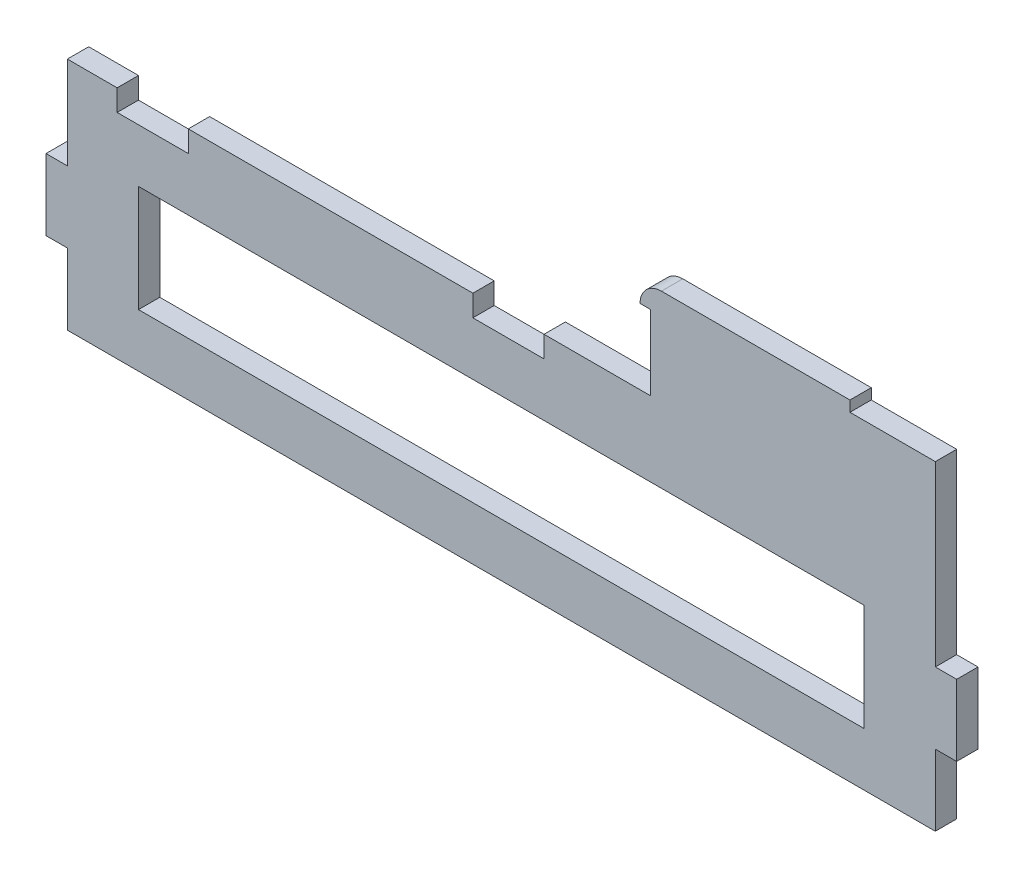
ISO-10303-21;
HEADER;
FILE_DESCRIPTION(('STEP AP214'),'2;1');
FILE_NAME('part.step','',(''),(''),'','','');
FILE_SCHEMA(('AUTOMOTIVE_DESIGN { 1 0 10303 214 1 1 1 1 }'));
ENDSEC;
DATA;
#1=APPLICATION_CONTEXT('core data for automotive mechanical design processes');
#2=APPLICATION_PROTOCOL_DEFINITION('international standard','automotive_design',2000,#1);
#3=PRODUCT_CONTEXT('',#1,'mechanical');
#4=PRODUCT('Part','Part','',(#3));
#5=PRODUCT_RELATED_PRODUCT_CATEGORY('part','',(#4));
#6=PRODUCT_DEFINITION_FORMATION('','',#4);
#7=PRODUCT_DEFINITION_CONTEXT('part definition',#1,'design');
#8=PRODUCT_DEFINITION('design','',#6,#7);
#9=PRODUCT_DEFINITION_SHAPE('','',#8);
#10=(LENGTH_UNIT() NAMED_UNIT(*) SI_UNIT(.MILLI.,.METRE.));
#11=(NAMED_UNIT(*) PLANE_ANGLE_UNIT() SI_UNIT($,.RADIAN.));
#12=(NAMED_UNIT(*) SI_UNIT($,.STERADIAN.) SOLID_ANGLE_UNIT());
#13=UNCERTAINTY_MEASURE_WITH_UNIT(LENGTH_MEASURE(1.E-05),#10,'distance_accuracy_value','');
#14=(GEOMETRIC_REPRESENTATION_CONTEXT(3) GLOBAL_UNCERTAINTY_ASSIGNED_CONTEXT((#13)) GLOBAL_UNIT_ASSIGNED_CONTEXT((#10,
#11,#12)) REPRESENTATION_CONTEXT('',''));
#15=CARTESIAN_POINT('',(0.,0.,0.));
#16=DIRECTION('',(0.,0.,1.));
#17=DIRECTION('',(1.,0.,0.));
#18=AXIS2_PLACEMENT_3D('',#15,#16,#17);
#19=CARTESIAN_POINT('',(167.,87.,6.));
#20=DIRECTION('',(0.,0.,-1.));
#21=DIRECTION('',(-1.,0.,0.));
#22=AXIS2_PLACEMENT_3D('',#19,#20,#21);
#23=CYLINDRICAL_SURFACE('',#22,6.);
#24=DIRECTION('',(0.,0.,-1.));
#25=VECTOR('',#24,1.);
#26=CARTESIAN_POINT('',(161.,87.,6.));
#27=LINE('',#26,#25);
#28=CARTESIAN_POINT('',(161.,87.,6.));
#29=VERTEX_POINT('',#28);
#30=CARTESIAN_POINT('',(161.,87.,0.));
#31=VERTEX_POINT('',#30);
#32=EDGE_CURVE('E506',#29,#31,#27,.T.);
#33=ORIENTED_EDGE('',*,*,#32,.F.);
#34=CARTESIAN_POINT('',(167.,87.,6.));
#35=DIRECTION('',(0.,0.,1.));
#36=DIRECTION('',(1.,0.,0.));
#37=AXIS2_PLACEMENT_3D('',#34,#35,#36);
#38=CIRCLE('',#37,6.);
#39=CARTESIAN_POINT('',(167.,93.,6.));
#40=VERTEX_POINT('',#39);
#41=EDGE_CURVE('E47',#40,#29,#38,.T.);
#42=ORIENTED_EDGE('',*,*,#41,.F.);
#43=DIRECTION('',(0.,0.,-1.));
#44=VECTOR('',#43,1.);
#45=CARTESIAN_POINT('',(167.,93.,6.));
#46=LINE('',#45,#44);
#47=CARTESIAN_POINT('',(167.,93.,0.));
#48=VERTEX_POINT('',#47);
#49=EDGE_CURVE('E542',#48,#40,#46,.F.);
#50=ORIENTED_EDGE('',*,*,#49,.F.);
#51=CARTESIAN_POINT('',(167.,87.,0.));
#52=DIRECTION('',(0.,0.,1.));
#53=DIRECTION('',(1.,0.,0.));
#54=AXIS2_PLACEMENT_3D('',#51,#52,#53);
#55=CIRCLE('',#54,6.);
#56=EDGE_CURVE('E11',#31,#48,#55,.F.);
#57=ORIENTED_EDGE('',*,*,#56,.F.);
#58=EDGE_LOOP('',(#33,#42,#50,#57));
#59=FACE_BOUND('',#58,.T.);
#60=ADVANCED_FACE('F39',(#59),#23,.T.);
#61=CARTESIAN_POINT('',(0.,0.,6.));
#62=DIRECTION('',(0.,0.,1.));
#63=DIRECTION('',(1.,0.,0.));
#64=AXIS2_PLACEMENT_3D('',#61,#62,#63);
#65=PLANE('',#64);
#66=DIRECTION('',(-1.,0.,0.));
#67=VECTOR('',#66,1.);
#68=CARTESIAN_POINT('',(161.,93.,6.));
#69=LINE('',#68,#67);
#70=CARTESIAN_POINT('',(220.,93.,6.));
#71=VERTEX_POINT('',#70);
#72=EDGE_CURVE('E315',#71,#40,#69,.T.);
#73=ORIENTED_EDGE('',*,*,#72,.T.);
#74=ORIENTED_EDGE('',*,*,#41,.T.);
#75=DIRECTION('',(1.,0.,0.));
#76=VECTOR('',#75,1.);
#77=CARTESIAN_POINT('',(164.,87.,6.));
#78=LINE('',#77,#76);
#79=CARTESIAN_POINT('',(164.,87.,6.));
#80=VERTEX_POINT('',#79);
#81=EDGE_CURVE('E319',#29,#80,#78,.T.);
#82=ORIENTED_EDGE('',*,*,#81,.T.);
#83=DIRECTION('',(0.,-1.,0.));
#84=VECTOR('',#83,1.);
#85=CARTESIAN_POINT('',(164.,87.,6.));
#86=LINE('',#85,#84);
#87=CARTESIAN_POINT('',(164.,66.,6.));
#88=VERTEX_POINT('',#87);
#89=EDGE_CURVE('E322',#80,#88,#86,.T.);
#90=ORIENTED_EDGE('',*,*,#89,.T.);
#91=DIRECTION('',(-1.,0.,0.));
#92=VECTOR('',#91,1.);
#93=CARTESIAN_POINT('',(164.,66.,6.));
#94=LINE('',#93,#92);
#95=CARTESIAN_POINT('',(134.,66.,6.));
#96=VERTEX_POINT('',#95);
#97=EDGE_CURVE('E325',#88,#96,#94,.T.);
#98=ORIENTED_EDGE('',*,*,#97,.T.);
#99=DIRECTION('',(0.,-1.,0.));
#100=VECTOR('',#99,1.);
#101=CARTESIAN_POINT('',(134.,66.,6.));
#102=LINE('',#101,#100);
#103=CARTESIAN_POINT('',(134.,60.,6.));
#104=VERTEX_POINT('',#103);
#105=EDGE_CURVE('E328',#96,#104,#102,.T.);
#106=ORIENTED_EDGE('',*,*,#105,.T.);
#107=DIRECTION('',(-1.,0.,0.));
#108=VECTOR('',#107,1.);
#109=CARTESIAN_POINT('',(134.,60.,6.));
#110=LINE('',#109,#108);
#111=CARTESIAN_POINT('',(114.,60.,6.));
#112=VERTEX_POINT('',#111);
#113=EDGE_CURVE('E331',#104,#112,#110,.T.);
#114=ORIENTED_EDGE('',*,*,#113,.T.);
#115=DIRECTION('',(0.,1.,0.));
#116=VECTOR('',#115,1.);
#117=CARTESIAN_POINT('',(114.,60.,6.));
#118=LINE('',#117,#116);
#119=CARTESIAN_POINT('',(114.,66.,6.));
#120=VERTEX_POINT('',#119);
#121=EDGE_CURVE('E334',#112,#120,#118,.T.);
#122=ORIENTED_EDGE('',*,*,#121,.T.);
#123=DIRECTION('',(-1.,0.,0.));
#124=VECTOR('',#123,1.);
#125=CARTESIAN_POINT('',(114.,66.,6.));
#126=LINE('',#125,#124);
#127=CARTESIAN_POINT('',(34.,66.,6.));
#128=VERTEX_POINT('',#127);
#129=EDGE_CURVE('E337',#120,#128,#126,.T.);
#130=ORIENTED_EDGE('',*,*,#129,.T.);
#131=DIRECTION('',(0.,-1.,0.));
#132=VECTOR('',#131,1.);
#133=CARTESIAN_POINT('',(34.,66.,6.));
#134=LINE('',#133,#132);
#135=CARTESIAN_POINT('',(34.,60.,6.));
#136=VERTEX_POINT('',#135);
#137=EDGE_CURVE('E340',#128,#136,#134,.T.);
#138=ORIENTED_EDGE('',*,*,#137,.T.);
#139=DIRECTION('',(-1.,0.,0.));
#140=VECTOR('',#139,1.);
#141=CARTESIAN_POINT('',(34.,60.,6.));
#142=LINE('',#141,#140);
#143=CARTESIAN_POINT('',(14.,60.,6.));
#144=VERTEX_POINT('',#143);
#145=EDGE_CURVE('E343',#136,#144,#142,.T.);
#146=ORIENTED_EDGE('',*,*,#145,.T.);
#147=DIRECTION('',(0.,1.,0.));
#148=VECTOR('',#147,1.);
#149=CARTESIAN_POINT('',(14.,60.,6.));
#150=LINE('',#149,#148);
#151=CARTESIAN_POINT('',(14.,66.,6.));
#152=VERTEX_POINT('',#151);
#153=EDGE_CURVE('E346',#144,#152,#150,.T.);
#154=ORIENTED_EDGE('',*,*,#153,.T.);
#155=DIRECTION('',(-1.,0.,0.));
#156=VECTOR('',#155,1.);
#157=CARTESIAN_POINT('',(14.,66.,6.));
#158=LINE('',#157,#156);
#159=CARTESIAN_POINT('',(0.,66.,6.));
#160=VERTEX_POINT('',#159);
#161=EDGE_CURVE('E349',#152,#160,#158,.T.);
#162=ORIENTED_EDGE('',*,*,#161,.T.);
#163=DIRECTION('',(0.,-1.,0.));
#164=VECTOR('',#163,1.);
#165=CARTESIAN_POINT('',(0.,66.,6.));
#166=LINE('',#165,#164);
#167=CARTESIAN_POINT('',(0.,40.,6.));
#168=VERTEX_POINT('',#167);
#169=EDGE_CURVE('E352',#160,#168,#166,.T.);
#170=ORIENTED_EDGE('',*,*,#169,.T.);
#171=DIRECTION('',(-1.,0.,0.));
#172=VECTOR('',#171,1.);
#173=CARTESIAN_POINT('',(0.,40.,6.));
#174=LINE('',#173,#172);
#175=CARTESIAN_POINT('',(-6.,40.,6.));
#176=VERTEX_POINT('',#175);
#177=EDGE_CURVE('E355',#168,#176,#174,.T.);
#178=ORIENTED_EDGE('',*,*,#177,.T.);
#179=DIRECTION('',(0.,-1.,0.));
#180=VECTOR('',#179,1.);
#181=CARTESIAN_POINT('',(-6.,40.,6.));
#182=LINE('',#181,#180);
#183=CARTESIAN_POINT('',(-6.,20.,6.));
#184=VERTEX_POINT('',#183);
#185=EDGE_CURVE('E358',#176,#184,#182,.T.);
#186=ORIENTED_EDGE('',*,*,#185,.T.);
#187=DIRECTION('',(1.,0.,0.));
#188=VECTOR('',#187,1.);
#189=CARTESIAN_POINT('',(0.,20.,6.));
#190=LINE('',#189,#188);
#191=CARTESIAN_POINT('',(0.,20.,6.));
#192=VERTEX_POINT('',#191);
#193=EDGE_CURVE('E361',#184,#192,#190,.T.);
#194=ORIENTED_EDGE('',*,*,#193,.T.);
#195=DIRECTION('',(0.,-1.,0.));
#196=VECTOR('',#195,1.);
#197=CARTESIAN_POINT('',(0.,20.,6.));
#198=LINE('',#197,#196);
#199=CARTESIAN_POINT('',(0.,0.,6.));
#200=VERTEX_POINT('',#199);
#201=EDGE_CURVE('E364',#192,#200,#198,.T.);
#202=ORIENTED_EDGE('',*,*,#201,.T.);
#203=DIRECTION('',(1.,0.,0.));
#204=VECTOR('',#203,1.);
#205=CARTESIAN_POINT('',(0.,0.,6.));
#206=LINE('',#205,#204);
#207=CARTESIAN_POINT('',(244.,0.,6.));
#208=VERTEX_POINT('',#207);
#209=EDGE_CURVE('E289',#200,#208,#206,.T.);
#210=ORIENTED_EDGE('',*,*,#209,.T.);
#211=DIRECTION('',(0.,1.,0.));
#212=VECTOR('',#211,1.);
#213=CARTESIAN_POINT('',(244.,0.,6.));
#214=LINE('',#213,#212);
#215=CARTESIAN_POINT('',(244.,20.,6.));
#216=VERTEX_POINT('',#215);
#217=EDGE_CURVE('E293',#208,#216,#214,.T.);
#218=ORIENTED_EDGE('',*,*,#217,.T.);
#219=DIRECTION('',(1.,0.,0.));
#220=VECTOR('',#219,1.);
#221=CARTESIAN_POINT('',(244.,20.,6.));
#222=LINE('',#221,#220);
#223=CARTESIAN_POINT('',(250.,20.,6.));
#224=VERTEX_POINT('',#223);
#225=EDGE_CURVE('E297',#216,#224,#222,.T.);
#226=ORIENTED_EDGE('',*,*,#225,.T.);
#227=DIRECTION('',(0.,1.,0.));
#228=VECTOR('',#227,1.);
#229=CARTESIAN_POINT('',(250.,40.,6.));
#230=LINE('',#229,#228);
#231=CARTESIAN_POINT('',(250.,40.,6.));
#232=VERTEX_POINT('',#231);
#233=EDGE_CURVE('E300',#224,#232,#230,.T.);
#234=ORIENTED_EDGE('',*,*,#233,.T.);
#235=DIRECTION('',(-1.,0.,0.));
#236=VECTOR('',#235,1.);
#237=CARTESIAN_POINT('',(244.,40.,6.));
#238=LINE('',#237,#236);
#239=CARTESIAN_POINT('',(244.,40.,6.));
#240=VERTEX_POINT('',#239);
#241=EDGE_CURVE('E303',#232,#240,#238,.T.);
#242=ORIENTED_EDGE('',*,*,#241,.T.);
#243=DIRECTION('',(0.,1.,0.));
#244=VECTOR('',#243,1.);
#245=CARTESIAN_POINT('',(244.,90.,6.));
#246=LINE('',#245,#244);
#247=CARTESIAN_POINT('',(244.,90.,6.));
#248=VERTEX_POINT('',#247);
#249=EDGE_CURVE('E306',#240,#248,#246,.T.);
#250=ORIENTED_EDGE('',*,*,#249,.T.);
#251=DIRECTION('',(-1.,0.,0.));
#252=VECTOR('',#251,1.);
#253=CARTESIAN_POINT('',(220.,90.,6.));
#254=LINE('',#253,#252);
#255=CARTESIAN_POINT('',(220.,90.,6.));
#256=VERTEX_POINT('',#255);
#257=EDGE_CURVE('E309',#248,#256,#254,.T.);
#258=ORIENTED_EDGE('',*,*,#257,.T.);
#259=DIRECTION('',(0.,1.,0.));
#260=VECTOR('',#259,1.);
#261=CARTESIAN_POINT('',(220.,93.,6.));
#262=LINE('',#261,#260);
#263=EDGE_CURVE('E312',#256,#71,#262,.T.);
#264=ORIENTED_EDGE('',*,*,#263,.T.);
#265=EDGE_LOOP('',(#73,#74,#82,#90,#98,#106,#114,#122,#130,#138,#146,#154,#162,#170,#178,#186,
#194,#202,#210,#218,#226,#234,#242,#250,#258,#264));
#266=FACE_BOUND('',#265,.T.);
#267=DIRECTION('',(1.,0.,0.));
#268=VECTOR('',#267,1.);
#269=CARTESIAN_POINT('',(20.,15.,6.));
#270=LINE('',#269,#268);
#271=CARTESIAN_POINT('',(20.,15.,6.));
#272=VERTEX_POINT('',#271);
#273=CARTESIAN_POINT('',(224.,15.,6.));
#274=VERTEX_POINT('',#273);
#275=EDGE_CURVE('E246',#272,#274,#270,.T.);
#276=ORIENTED_EDGE('',*,*,#275,.F.);
#277=DIRECTION('',(0.,-1.,0.));
#278=VECTOR('',#277,1.);
#279=CARTESIAN_POINT('',(20.,15.,6.));
#280=LINE('',#279,#278);
#281=CARTESIAN_POINT('',(20.,45.,6.));
#282=VERTEX_POINT('',#281);
#283=EDGE_CURVE('E235',#282,#272,#280,.T.);
#284=ORIENTED_EDGE('',*,*,#283,.F.);
#285=DIRECTION('',(-1.,0.,0.));
#286=VECTOR('',#285,1.);
#287=CARTESIAN_POINT('',(20.,45.,6.));
#288=LINE('',#287,#286);
#289=CARTESIAN_POINT('',(224.,45.,6.));
#290=VERTEX_POINT('',#289);
#291=EDGE_CURVE('E265',#290,#282,#288,.T.);
#292=ORIENTED_EDGE('',*,*,#291,.F.);
#293=DIRECTION('',(0.,1.,0.));
#294=VECTOR('',#293,1.);
#295=CARTESIAN_POINT('',(224.,15.,6.));
#296=LINE('',#295,#294);
#297=EDGE_CURVE('E261',#274,#290,#296,.T.);
#298=ORIENTED_EDGE('',*,*,#297,.F.);
#299=EDGE_LOOP('',(#276,#284,#292,#298));
#300=FACE_BOUND('',#299,.T.);
#301=ADVANCED_FACE('F259',(#266,#300),#65,.T.);
#302=CARTESIAN_POINT('',(0.,0.,0.));
#303=DIRECTION('',(0.,0.,1.));
#304=DIRECTION('',(1.,0.,0.));
#305=AXIS2_PLACEMENT_3D('',#302,#303,#304);
#306=PLANE('',#305);
#307=DIRECTION('',(1.,0.,0.));
#308=VECTOR('',#307,1.);
#309=CARTESIAN_POINT('',(164.,87.,0.));
#310=LINE('',#309,#308);
#311=CARTESIAN_POINT('',(164.,87.,0.));
#312=VERTEX_POINT('',#311);
#313=EDGE_CURVE('E396',#31,#312,#310,.T.);
#314=ORIENTED_EDGE('',*,*,#313,.F.);
#315=ORIENTED_EDGE('',*,*,#56,.T.);
#316=DIRECTION('',(-1.,0.,0.));
#317=VECTOR('',#316,1.);
#318=CARTESIAN_POINT('',(161.,93.,0.));
#319=LINE('',#318,#317);
#320=CARTESIAN_POINT('',(220.,93.,0.));
#321=VERTEX_POINT('',#320);
#322=EDGE_CURVE('E392',#321,#48,#319,.T.);
#323=ORIENTED_EDGE('',*,*,#322,.F.);
#324=DIRECTION('',(0.,1.,0.));
#325=VECTOR('',#324,1.);
#326=CARTESIAN_POINT('',(220.,93.,0.));
#327=LINE('',#326,#325);
#328=CARTESIAN_POINT('',(220.,90.,0.));
#329=VERTEX_POINT('',#328);
#330=EDGE_CURVE('E389',#329,#321,#327,.T.);
#331=ORIENTED_EDGE('',*,*,#330,.F.);
#332=DIRECTION('',(-1.,0.,0.));
#333=VECTOR('',#332,1.);
#334=CARTESIAN_POINT('',(220.,90.,0.));
#335=LINE('',#334,#333);
#336=CARTESIAN_POINT('',(244.,90.,0.));
#337=VERTEX_POINT('',#336);
#338=EDGE_CURVE('E386',#337,#329,#335,.T.);
#339=ORIENTED_EDGE('',*,*,#338,.F.);
#340=DIRECTION('',(0.,1.,0.));
#341=VECTOR('',#340,1.);
#342=CARTESIAN_POINT('',(244.,90.,0.));
#343=LINE('',#342,#341);
#344=CARTESIAN_POINT('',(244.,40.,0.));
#345=VERTEX_POINT('',#344);
#346=EDGE_CURVE('E383',#345,#337,#343,.T.);
#347=ORIENTED_EDGE('',*,*,#346,.F.);
#348=DIRECTION('',(-1.,0.,0.));
#349=VECTOR('',#348,1.);
#350=CARTESIAN_POINT('',(244.,40.,0.));
#351=LINE('',#350,#349);
#352=CARTESIAN_POINT('',(250.,40.,0.));
#353=VERTEX_POINT('',#352);
#354=EDGE_CURVE('E380',#353,#345,#351,.T.);
#355=ORIENTED_EDGE('',*,*,#354,.F.);
#356=DIRECTION('',(0.,1.,0.));
#357=VECTOR('',#356,1.);
#358=CARTESIAN_POINT('',(250.,40.,0.));
#359=LINE('',#358,#357);
#360=CARTESIAN_POINT('',(250.,20.,0.));
#361=VERTEX_POINT('',#360);
#362=EDGE_CURVE('E377',#361,#353,#359,.T.);
#363=ORIENTED_EDGE('',*,*,#362,.F.);
#364=DIRECTION('',(1.,0.,0.));
#365=VECTOR('',#364,1.);
#366=CARTESIAN_POINT('',(244.,20.,0.));
#367=LINE('',#366,#365);
#368=CARTESIAN_POINT('',(244.,20.,0.));
#369=VERTEX_POINT('',#368);
#370=EDGE_CURVE('E374',#369,#361,#367,.T.);
#371=ORIENTED_EDGE('',*,*,#370,.F.);
#372=DIRECTION('',(0.,1.,0.));
#373=VECTOR('',#372,1.);
#374=CARTESIAN_POINT('',(244.,0.,0.));
#375=LINE('',#374,#373);
#376=CARTESIAN_POINT('',(244.,0.,0.));
#377=VERTEX_POINT('',#376);
#378=EDGE_CURVE('E371',#377,#369,#375,.T.);
#379=ORIENTED_EDGE('',*,*,#378,.F.);
#380=DIRECTION('',(1.,0.,0.));
#381=VECTOR('',#380,1.);
#382=CARTESIAN_POINT('',(0.,0.,0.));
#383=LINE('',#382,#381);
#384=CARTESIAN_POINT('',(0.,0.,0.));
#385=VERTEX_POINT('',#384);
#386=EDGE_CURVE('E255',#385,#377,#383,.T.);
#387=ORIENTED_EDGE('',*,*,#386,.F.);
#388=DIRECTION('',(0.,-1.,0.));
#389=VECTOR('',#388,1.);
#390=CARTESIAN_POINT('',(0.,20.,0.));
#391=LINE('',#390,#389);
#392=CARTESIAN_POINT('',(0.,20.,0.));
#393=VERTEX_POINT('',#392);
#394=EDGE_CURVE('E294',#393,#385,#391,.T.);
#395=ORIENTED_EDGE('',*,*,#394,.F.);
#396=DIRECTION('',(1.,0.,0.));
#397=VECTOR('',#396,1.);
#398=CARTESIAN_POINT('',(0.,20.,0.));
#399=LINE('',#398,#397);
#400=CARTESIAN_POINT('',(-6.,20.,0.));
#401=VERTEX_POINT('',#400);
#402=EDGE_CURVE('E438',#401,#393,#399,.T.);
#403=ORIENTED_EDGE('',*,*,#402,.F.);
#404=DIRECTION('',(0.,-1.,0.));
#405=VECTOR('',#404,1.);
#406=CARTESIAN_POINT('',(-6.,40.,0.));
#407=LINE('',#406,#405);
#408=CARTESIAN_POINT('',(-6.,40.,0.));
#409=VERTEX_POINT('',#408);
#410=EDGE_CURVE('E435',#409,#401,#407,.T.);
#411=ORIENTED_EDGE('',*,*,#410,.F.);
#412=DIRECTION('',(-1.,0.,0.));
#413=VECTOR('',#412,1.);
#414=CARTESIAN_POINT('',(0.,40.,0.));
#415=LINE('',#414,#413);
#416=CARTESIAN_POINT('',(0.,40.,0.));
#417=VERTEX_POINT('',#416);
#418=EDGE_CURVE('E432',#417,#409,#415,.T.);
#419=ORIENTED_EDGE('',*,*,#418,.F.);
#420=DIRECTION('',(0.,-1.,0.));
#421=VECTOR('',#420,1.);
#422=CARTESIAN_POINT('',(0.,66.,0.));
#423=LINE('',#422,#421);
#424=CARTESIAN_POINT('',(0.,66.,0.));
#425=VERTEX_POINT('',#424);
#426=EDGE_CURVE('E429',#425,#417,#423,.T.);
#427=ORIENTED_EDGE('',*,*,#426,.F.);
#428=DIRECTION('',(-1.,0.,0.));
#429=VECTOR('',#428,1.);
#430=CARTESIAN_POINT('',(14.,66.,0.));
#431=LINE('',#430,#429);
#432=CARTESIAN_POINT('',(14.,66.,0.));
#433=VERTEX_POINT('',#432);
#434=EDGE_CURVE('E426',#433,#425,#431,.T.);
#435=ORIENTED_EDGE('',*,*,#434,.F.);
#436=DIRECTION('',(0.,1.,0.));
#437=VECTOR('',#436,1.);
#438=CARTESIAN_POINT('',(14.,60.,0.));
#439=LINE('',#438,#437);
#440=CARTESIAN_POINT('',(14.,60.,0.));
#441=VERTEX_POINT('',#440);
#442=EDGE_CURVE('E423',#441,#433,#439,.T.);
#443=ORIENTED_EDGE('',*,*,#442,.F.);
#444=DIRECTION('',(-1.,0.,0.));
#445=VECTOR('',#444,1.);
#446=CARTESIAN_POINT('',(34.,60.,0.));
#447=LINE('',#446,#445);
#448=CARTESIAN_POINT('',(34.,60.,0.));
#449=VERTEX_POINT('',#448);
#450=EDGE_CURVE('E420',#449,#441,#447,.T.);
#451=ORIENTED_EDGE('',*,*,#450,.F.);
#452=DIRECTION('',(0.,-1.,0.));
#453=VECTOR('',#452,1.);
#454=CARTESIAN_POINT('',(34.,66.,0.));
#455=LINE('',#454,#453);
#456=CARTESIAN_POINT('',(34.,66.,0.));
#457=VERTEX_POINT('',#456);
#458=EDGE_CURVE('E417',#457,#449,#455,.T.);
#459=ORIENTED_EDGE('',*,*,#458,.F.);
#460=DIRECTION('',(-1.,0.,0.));
#461=VECTOR('',#460,1.);
#462=CARTESIAN_POINT('',(114.,66.,0.));
#463=LINE('',#462,#461);
#464=CARTESIAN_POINT('',(114.,66.,0.));
#465=VERTEX_POINT('',#464);
#466=EDGE_CURVE('E414',#465,#457,#463,.T.);
#467=ORIENTED_EDGE('',*,*,#466,.F.);
#468=DIRECTION('',(0.,1.,0.));
#469=VECTOR('',#468,1.);
#470=CARTESIAN_POINT('',(114.,60.,0.));
#471=LINE('',#470,#469);
#472=CARTESIAN_POINT('',(114.,60.,0.));
#473=VERTEX_POINT('',#472);
#474=EDGE_CURVE('E411',#473,#465,#471,.T.);
#475=ORIENTED_EDGE('',*,*,#474,.F.);
#476=DIRECTION('',(-1.,0.,0.));
#477=VECTOR('',#476,1.);
#478=CARTESIAN_POINT('',(134.,60.,0.));
#479=LINE('',#478,#477);
#480=CARTESIAN_POINT('',(134.,60.,0.));
#481=VERTEX_POINT('',#480);
#482=EDGE_CURVE('E408',#481,#473,#479,.T.);
#483=ORIENTED_EDGE('',*,*,#482,.F.);
#484=DIRECTION('',(0.,-1.,0.));
#485=VECTOR('',#484,1.);
#486=CARTESIAN_POINT('',(134.,66.,0.));
#487=LINE('',#486,#485);
#488=CARTESIAN_POINT('',(134.,66.,0.));
#489=VERTEX_POINT('',#488);
#490=EDGE_CURVE('E405',#489,#481,#487,.T.);
#491=ORIENTED_EDGE('',*,*,#490,.F.);
#492=DIRECTION('',(-1.,0.,0.));
#493=VECTOR('',#492,1.);
#494=CARTESIAN_POINT('',(164.,66.,0.));
#495=LINE('',#494,#493);
#496=CARTESIAN_POINT('',(164.,66.,0.));
#497=VERTEX_POINT('',#496);
#498=EDGE_CURVE('E402',#497,#489,#495,.T.);
#499=ORIENTED_EDGE('',*,*,#498,.F.);
#500=DIRECTION('',(0.,-1.,0.));
#501=VECTOR('',#500,1.);
#502=CARTESIAN_POINT('',(164.,87.,0.));
#503=LINE('',#502,#501);
#504=EDGE_CURVE('E399',#312,#497,#503,.T.);
#505=ORIENTED_EDGE('',*,*,#504,.F.);
#506=EDGE_LOOP('',(#314,#315,#323,#331,#339,#347,#355,#363,#371,#379,#387,#395,#403,#411,#419,
#427,#435,#443,#451,#459,#467,#475,#483,#491,#499,#505));
#507=FACE_BOUND('',#506,.T.);
#508=DIRECTION('',(0.,-1.,0.));
#509=VECTOR('',#508,1.);
#510=CARTESIAN_POINT('',(20.,15.,0.));
#511=LINE('',#510,#509);
#512=CARTESIAN_POINT('',(20.,45.,0.));
#513=VERTEX_POINT('',#512);
#514=CARTESIAN_POINT('',(20.,15.,0.));
#515=VERTEX_POINT('',#514);
#516=EDGE_CURVE('E270',#513,#515,#511,.T.);
#517=ORIENTED_EDGE('',*,*,#516,.T.);
#518=DIRECTION('',(1.,0.,0.));
#519=VECTOR('',#518,1.);
#520=CARTESIAN_POINT('',(20.,15.,0.));
#521=LINE('',#520,#519);
#522=CARTESIAN_POINT('',(224.,15.,0.));
#523=VERTEX_POINT('',#522);
#524=EDGE_CURVE('E253',#515,#523,#521,.T.);
#525=ORIENTED_EDGE('',*,*,#524,.T.);
#526=DIRECTION('',(0.,1.,0.));
#527=VECTOR('',#526,1.);
#528=CARTESIAN_POINT('',(224.,15.,0.));
#529=LINE('',#528,#527);
#530=CARTESIAN_POINT('',(224.,45.,0.));
#531=VERTEX_POINT('',#530);
#532=EDGE_CURVE('E275',#523,#531,#529,.T.);
#533=ORIENTED_EDGE('',*,*,#532,.T.);
#534=DIRECTION('',(-1.,0.,0.));
#535=VECTOR('',#534,1.);
#536=CARTESIAN_POINT('',(20.,45.,0.));
#537=LINE('',#536,#535);
#538=EDGE_CURVE('E247',#531,#513,#537,.T.);
#539=ORIENTED_EDGE('',*,*,#538,.T.);
#540=EDGE_LOOP('',(#517,#525,#533,#539));
#541=FACE_BOUND('',#540,.T.);
#542=ADVANCED_FACE('F666',(#507,#541),#306,.F.);
#543=CARTESIAN_POINT('',(0.,0.,6.));
#544=DIRECTION('',(0.,1.,0.));
#545=DIRECTION('',(0.,0.,1.));
#546=AXIS2_PLACEMENT_3D('',#543,#544,#545);
#547=PLANE('',#546);
#548=ORIENTED_EDGE('',*,*,#386,.T.);
#549=DIRECTION('',(0.,0.,-1.));
#550=VECTOR('',#549,1.);
#551=CARTESIAN_POINT('',(244.,0.,6.));
#552=LINE('',#551,#550);
#553=EDGE_CURVE('E538',#208,#377,#552,.T.);
#554=ORIENTED_EDGE('',*,*,#553,.F.);
#555=ORIENTED_EDGE('',*,*,#209,.F.);
#556=DIRECTION('',(0.,0.,-1.));
#557=VECTOR('',#556,1.);
#558=CARTESIAN_POINT('',(0.,0.,6.));
#559=LINE('',#558,#557);
#560=EDGE_CURVE('E367',#200,#385,#559,.T.);
#561=ORIENTED_EDGE('',*,*,#560,.T.);
#562=EDGE_LOOP('',(#548,#554,#555,#561));
#563=FACE_BOUND('',#562,.T.);
#564=ADVANCED_FACE('F630',(#563),#547,.F.);
#565=CARTESIAN_POINT('',(244.,0.,6.));
#566=DIRECTION('',(-1.,0.,0.));
#567=DIRECTION('',(0.,0.,1.));
#568=AXIS2_PLACEMENT_3D('',#565,#566,#567);
#569=PLANE('',#568);
#570=ORIENTED_EDGE('',*,*,#378,.T.);
#571=DIRECTION('',(0.,0.,-1.));
#572=VECTOR('',#571,1.);
#573=CARTESIAN_POINT('',(244.,20.,6.));
#574=LINE('',#573,#572);
#575=EDGE_CURVE('E534',#216,#369,#574,.T.);
#576=ORIENTED_EDGE('',*,*,#575,.F.);
#577=ORIENTED_EDGE('',*,*,#217,.F.);
#578=ORIENTED_EDGE('',*,*,#553,.T.);
#579=EDGE_LOOP('',(#570,#576,#577,#578));
#580=FACE_BOUND('',#579,.T.);
#581=ADVANCED_FACE('F635',(#580),#569,.F.);
#582=CARTESIAN_POINT('',(244.,20.,6.));
#583=DIRECTION('',(0.,1.,0.));
#584=DIRECTION('',(0.,0.,1.));
#585=AXIS2_PLACEMENT_3D('',#582,#583,#584);
#586=PLANE('',#585);
#587=ORIENTED_EDGE('',*,*,#370,.T.);
#588=DIRECTION('',(0.,0.,-1.));
#589=VECTOR('',#588,1.);
#590=CARTESIAN_POINT('',(250.,20.,6.));
#591=LINE('',#590,#589);
#592=EDGE_CURVE('E530',#224,#361,#591,.T.);
#593=ORIENTED_EDGE('',*,*,#592,.F.);
#594=ORIENTED_EDGE('',*,*,#225,.F.);
#595=ORIENTED_EDGE('',*,*,#575,.T.);
#596=EDGE_LOOP('',(#587,#593,#594,#595));
#597=FACE_BOUND('',#596,.T.);
#598=ADVANCED_FACE('F638',(#597),#586,.F.);
#599=CARTESIAN_POINT('',(250.,40.,6.));
#600=DIRECTION('',(-1.,0.,0.));
#601=DIRECTION('',(0.,0.,1.));
#602=AXIS2_PLACEMENT_3D('',#599,#600,#601);
#603=PLANE('',#602);
#604=ORIENTED_EDGE('',*,*,#362,.T.);
#605=DIRECTION('',(0.,0.,-1.));
#606=VECTOR('',#605,1.);
#607=CARTESIAN_POINT('',(250.,40.,6.));
#608=LINE('',#607,#606);
#609=EDGE_CURVE('E526',#232,#353,#608,.T.);
#610=ORIENTED_EDGE('',*,*,#609,.F.);
#611=ORIENTED_EDGE('',*,*,#233,.F.);
#612=ORIENTED_EDGE('',*,*,#592,.T.);
#613=EDGE_LOOP('',(#604,#610,#611,#612));
#614=FACE_BOUND('',#613,.T.);
#615=ADVANCED_FACE('F643',(#614),#603,.F.);
#616=CARTESIAN_POINT('',(244.,40.,6.));
#617=DIRECTION('',(0.,-1.,0.));
#618=DIRECTION('',(0.,0.,-1.));
#619=AXIS2_PLACEMENT_3D('',#616,#617,#618);
#620=PLANE('',#619);
#621=ORIENTED_EDGE('',*,*,#354,.T.);
#622=DIRECTION('',(0.,0.,-1.));
#623=VECTOR('',#622,1.);
#624=CARTESIAN_POINT('',(244.,40.,6.));
#625=LINE('',#624,#623);
#626=EDGE_CURVE('E522',#240,#345,#625,.T.);
#627=ORIENTED_EDGE('',*,*,#626,.F.);
#628=ORIENTED_EDGE('',*,*,#241,.F.);
#629=ORIENTED_EDGE('',*,*,#609,.T.);
#630=EDGE_LOOP('',(#621,#627,#628,#629));
#631=FACE_BOUND('',#630,.T.);
#632=ADVANCED_FACE('F649',(#631),#620,.F.);
#633=CARTESIAN_POINT('',(244.,90.,6.));
#634=DIRECTION('',(-1.,0.,0.));
#635=DIRECTION('',(0.,0.,1.));
#636=AXIS2_PLACEMENT_3D('',#633,#634,#635);
#637=PLANE('',#636);
#638=ORIENTED_EDGE('',*,*,#346,.T.);
#639=DIRECTION('',(0.,0.,-1.));
#640=VECTOR('',#639,1.);
#641=CARTESIAN_POINT('',(244.,90.,6.));
#642=LINE('',#641,#640);
#643=EDGE_CURVE('E518',#248,#337,#642,.T.);
#644=ORIENTED_EDGE('',*,*,#643,.F.);
#645=ORIENTED_EDGE('',*,*,#249,.F.);
#646=ORIENTED_EDGE('',*,*,#626,.T.);
#647=EDGE_LOOP('',(#638,#644,#645,#646));
#648=FACE_BOUND('',#647,.T.);
#649=ADVANCED_FACE('F653',(#648),#637,.F.);
#650=CARTESIAN_POINT('',(220.,90.,6.));
#651=DIRECTION('',(0.,-1.,0.));
#652=DIRECTION('',(0.,0.,-1.));
#653=AXIS2_PLACEMENT_3D('',#650,#651,#652);
#654=PLANE('',#653);
#655=ORIENTED_EDGE('',*,*,#338,.T.);
#656=DIRECTION('',(0.,0.,-1.));
#657=VECTOR('',#656,1.);
#658=CARTESIAN_POINT('',(220.,90.,6.));
#659=LINE('',#658,#657);
#660=EDGE_CURVE('E514',#256,#329,#659,.T.);
#661=ORIENTED_EDGE('',*,*,#660,.F.);
#662=ORIENTED_EDGE('',*,*,#257,.F.);
#663=ORIENTED_EDGE('',*,*,#643,.T.);
#664=EDGE_LOOP('',(#655,#661,#662,#663));
#665=FACE_BOUND('',#664,.T.);
#666=ADVANCED_FACE('F658',(#665),#654,.F.);
#667=CARTESIAN_POINT('',(220.,93.,6.));
#668=DIRECTION('',(-1.,0.,0.));
#669=DIRECTION('',(0.,0.,1.));
#670=AXIS2_PLACEMENT_3D('',#667,#668,#669);
#671=PLANE('',#670);
#672=ORIENTED_EDGE('',*,*,#330,.T.);
#673=DIRECTION('',(0.,0.,-1.));
#674=VECTOR('',#673,1.);
#675=CARTESIAN_POINT('',(220.,93.,6.));
#676=LINE('',#675,#674);
#677=EDGE_CURVE('E510',#71,#321,#676,.T.);
#678=ORIENTED_EDGE('',*,*,#677,.F.);
#679=ORIENTED_EDGE('',*,*,#263,.F.);
#680=ORIENTED_EDGE('',*,*,#660,.T.);
#681=EDGE_LOOP('',(#672,#678,#679,#680));
#682=FACE_BOUND('',#681,.T.);
#683=ADVANCED_FACE('F662',(#682),#671,.F.);
#684=CARTESIAN_POINT('',(161.,93.,6.));
#685=DIRECTION('',(0.,-1.,0.));
#686=DIRECTION('',(1.,0.,0.));
#687=AXIS2_PLACEMENT_3D('',#684,#685,#686);
#688=PLANE('',#687);
#689=ORIENTED_EDGE('',*,*,#322,.T.);
#690=ORIENTED_EDGE('',*,*,#49,.T.);
#691=ORIENTED_EDGE('',*,*,#72,.F.);
#692=ORIENTED_EDGE('',*,*,#677,.T.);
#693=EDGE_LOOP('',(#689,#690,#691,#692));
#694=FACE_BOUND('',#693,.T.);
#695=ADVANCED_FACE('F665',(#694),#688,.F.);
#696=CARTESIAN_POINT('',(164.,87.,6.));
#697=DIRECTION('',(0.,1.,0.));
#698=DIRECTION('',(0.,0.,1.));
#699=AXIS2_PLACEMENT_3D('',#696,#697,#698);
#700=PLANE('',#699);
#701=ORIENTED_EDGE('',*,*,#313,.T.);
#702=DIRECTION('',(0.,0.,-1.));
#703=VECTOR('',#702,1.);
#704=CARTESIAN_POINT('',(164.,87.,6.));
#705=LINE('',#704,#703);
#706=EDGE_CURVE('E502',#80,#312,#705,.T.);
#707=ORIENTED_EDGE('',*,*,#706,.F.);
#708=ORIENTED_EDGE('',*,*,#81,.F.);
#709=ORIENTED_EDGE('',*,*,#32,.T.);
#710=EDGE_LOOP('',(#701,#707,#708,#709));
#711=FACE_BOUND('',#710,.T.);
#712=ADVANCED_FACE('F550',(#711),#700,.F.);
#713=CARTESIAN_POINT('',(164.,87.,6.));
#714=DIRECTION('',(1.,0.,0.));
#715=DIRECTION('',(0.,0.,-1.));
#716=AXIS2_PLACEMENT_3D('',#713,#714,#715);
#717=PLANE('',#716);
#718=ORIENTED_EDGE('',*,*,#504,.T.);
#719=DIRECTION('',(0.,0.,-1.));
#720=VECTOR('',#719,1.);
#721=CARTESIAN_POINT('',(164.,66.,6.));
#722=LINE('',#721,#720);
#723=EDGE_CURVE('E498',#88,#497,#722,.T.);
#724=ORIENTED_EDGE('',*,*,#723,.F.);
#725=ORIENTED_EDGE('',*,*,#89,.F.);
#726=ORIENTED_EDGE('',*,*,#706,.T.);
#727=EDGE_LOOP('',(#718,#724,#725,#726));
#728=FACE_BOUND('',#727,.T.);
#729=ADVANCED_FACE('F555',(#728),#717,.F.);
#730=CARTESIAN_POINT('',(164.,66.,6.));
#731=DIRECTION('',(0.,-1.,0.));
#732=DIRECTION('',(1.,0.,0.));
#733=AXIS2_PLACEMENT_3D('',#730,#731,#732);
#734=PLANE('',#733);
#735=ORIENTED_EDGE('',*,*,#498,.T.);
#736=DIRECTION('',(0.,0.,-1.));
#737=VECTOR('',#736,1.);
#738=CARTESIAN_POINT('',(134.,66.,6.));
#739=LINE('',#738,#737);
#740=EDGE_CURVE('E494',#96,#489,#739,.T.);
#741=ORIENTED_EDGE('',*,*,#740,.F.);
#742=ORIENTED_EDGE('',*,*,#97,.F.);
#743=ORIENTED_EDGE('',*,*,#723,.T.);
#744=EDGE_LOOP('',(#735,#741,#742,#743));
#745=FACE_BOUND('',#744,.T.);
#746=ADVANCED_FACE('F561',(#745),#734,.F.);
#747=CARTESIAN_POINT('',(134.,66.,6.));
#748=DIRECTION('',(1.,0.,0.));
#749=DIRECTION('',(0.,0.,-1.));
#750=AXIS2_PLACEMENT_3D('',#747,#748,#749);
#751=PLANE('',#750);
#752=ORIENTED_EDGE('',*,*,#490,.T.);
#753=DIRECTION('',(0.,0.,-1.));
#754=VECTOR('',#753,1.);
#755=CARTESIAN_POINT('',(134.,60.,6.));
#756=LINE('',#755,#754);
#757=EDGE_CURVE('E490',#104,#481,#756,.T.);
#758=ORIENTED_EDGE('',*,*,#757,.F.);
#759=ORIENTED_EDGE('',*,*,#105,.F.);
#760=ORIENTED_EDGE('',*,*,#740,.T.);
#761=EDGE_LOOP('',(#752,#758,#759,#760));
#762=FACE_BOUND('',#761,.T.);
#763=ADVANCED_FACE('F565',(#762),#751,.F.);
#764=CARTESIAN_POINT('',(134.,60.,6.));
#765=DIRECTION('',(0.,-1.,0.));
#766=DIRECTION('',(0.,0.,-1.));
#767=AXIS2_PLACEMENT_3D('',#764,#765,#766);
#768=PLANE('',#767);
#769=ORIENTED_EDGE('',*,*,#482,.T.);
#770=DIRECTION('',(0.,0.,-1.));
#771=VECTOR('',#770,1.);
#772=CARTESIAN_POINT('',(114.,60.,6.));
#773=LINE('',#772,#771);
#774=EDGE_CURVE('E486',#112,#473,#773,.T.);
#775=ORIENTED_EDGE('',*,*,#774,.F.);
#776=ORIENTED_EDGE('',*,*,#113,.F.);
#777=ORIENTED_EDGE('',*,*,#757,.T.);
#778=EDGE_LOOP('',(#769,#775,#776,#777));
#779=FACE_BOUND('',#778,.T.);
#780=ADVANCED_FACE('F570',(#779),#768,.F.);
#781=CARTESIAN_POINT('',(114.,60.,6.));
#782=DIRECTION('',(-1.,0.,0.));
#783=DIRECTION('',(0.,-1.,0.));
#784=AXIS2_PLACEMENT_3D('',#781,#782,#783);
#785=PLANE('',#784);
#786=ORIENTED_EDGE('',*,*,#474,.T.);
#787=DIRECTION('',(0.,0.,-1.));
#788=VECTOR('',#787,1.);
#789=CARTESIAN_POINT('',(114.,66.,6.));
#790=LINE('',#789,#788);
#791=EDGE_CURVE('E482',#120,#465,#790,.T.);
#792=ORIENTED_EDGE('',*,*,#791,.F.);
#793=ORIENTED_EDGE('',*,*,#121,.F.);
#794=ORIENTED_EDGE('',*,*,#774,.T.);
#795=EDGE_LOOP('',(#786,#792,#793,#794));
#796=FACE_BOUND('',#795,.T.);
#797=ADVANCED_FACE('F576',(#796),#785,.F.);
#798=CARTESIAN_POINT('',(114.,66.,6.));
#799=DIRECTION('',(0.,-1.,0.));
#800=DIRECTION('',(1.,0.,0.));
#801=AXIS2_PLACEMENT_3D('',#798,#799,#800);
#802=PLANE('',#801);
#803=ORIENTED_EDGE('',*,*,#466,.T.);
#804=DIRECTION('',(0.,0.,-1.));
#805=VECTOR('',#804,1.);
#806=CARTESIAN_POINT('',(34.,66.,6.));
#807=LINE('',#806,#805);
#808=EDGE_CURVE('E478',#128,#457,#807,.T.);
#809=ORIENTED_EDGE('',*,*,#808,.F.);
#810=ORIENTED_EDGE('',*,*,#129,.F.);
#811=ORIENTED_EDGE('',*,*,#791,.T.);
#812=EDGE_LOOP('',(#803,#809,#810,#811));
#813=FACE_BOUND('',#812,.T.);
#814=ADVANCED_FACE('F580',(#813),#802,.F.);
#815=CARTESIAN_POINT('',(34.,66.,6.));
#816=DIRECTION('',(1.,0.,0.));
#817=DIRECTION('',(0.,0.,-1.));
#818=AXIS2_PLACEMENT_3D('',#815,#816,#817);
#819=PLANE('',#818);
#820=ORIENTED_EDGE('',*,*,#458,.T.);
#821=DIRECTION('',(0.,0.,-1.));
#822=VECTOR('',#821,1.);
#823=CARTESIAN_POINT('',(34.,60.,6.));
#824=LINE('',#823,#822);
#825=EDGE_CURVE('E474',#136,#449,#824,.T.);
#826=ORIENTED_EDGE('',*,*,#825,.F.);
#827=ORIENTED_EDGE('',*,*,#137,.F.);
#828=ORIENTED_EDGE('',*,*,#808,.T.);
#829=EDGE_LOOP('',(#820,#826,#827,#828));
#830=FACE_BOUND('',#829,.T.);
#831=ADVANCED_FACE('F585',(#830),#819,.F.);
#832=CARTESIAN_POINT('',(34.,60.,6.));
#833=DIRECTION('',(0.,-1.,0.));
#834=DIRECTION('',(0.,0.,-1.));
#835=AXIS2_PLACEMENT_3D('',#832,#833,#834);
#836=PLANE('',#835);
#837=ORIENTED_EDGE('',*,*,#450,.T.);
#838=DIRECTION('',(0.,0.,-1.));
#839=VECTOR('',#838,1.);
#840=CARTESIAN_POINT('',(14.,60.,6.));
#841=LINE('',#840,#839);
#842=EDGE_CURVE('E470',#144,#441,#841,.T.);
#843=ORIENTED_EDGE('',*,*,#842,.F.);
#844=ORIENTED_EDGE('',*,*,#145,.F.);
#845=ORIENTED_EDGE('',*,*,#825,.T.);
#846=EDGE_LOOP('',(#837,#843,#844,#845));
#847=FACE_BOUND('',#846,.T.);
#848=ADVANCED_FACE('F591',(#847),#836,.F.);
#849=CARTESIAN_POINT('',(14.,60.,6.));
#850=DIRECTION('',(-1.,0.,0.));
#851=DIRECTION('',(0.,-1.,0.));
#852=AXIS2_PLACEMENT_3D('',#849,#850,#851);
#853=PLANE('',#852);
#854=ORIENTED_EDGE('',*,*,#442,.T.);
#855=DIRECTION('',(0.,0.,-1.));
#856=VECTOR('',#855,1.);
#857=CARTESIAN_POINT('',(14.,66.,6.));
#858=LINE('',#857,#856);
#859=EDGE_CURVE('E466',#152,#433,#858,.T.);
#860=ORIENTED_EDGE('',*,*,#859,.F.);
#861=ORIENTED_EDGE('',*,*,#153,.F.);
#862=ORIENTED_EDGE('',*,*,#842,.T.);
#863=EDGE_LOOP('',(#854,#860,#861,#862));
#864=FACE_BOUND('',#863,.T.);
#865=ADVANCED_FACE('F595',(#864),#853,.F.);
#866=CARTESIAN_POINT('',(14.,66.,6.));
#867=DIRECTION('',(0.,-1.,0.));
#868=DIRECTION('',(0.,0.,-1.));
#869=AXIS2_PLACEMENT_3D('',#866,#867,#868);
#870=PLANE('',#869);
#871=ORIENTED_EDGE('',*,*,#434,.T.);
#872=DIRECTION('',(0.,0.,-1.));
#873=VECTOR('',#872,1.);
#874=CARTESIAN_POINT('',(0.,66.,6.));
#875=LINE('',#874,#873);
#876=EDGE_CURVE('E462',#160,#425,#875,.T.);
#877=ORIENTED_EDGE('',*,*,#876,.F.);
#878=ORIENTED_EDGE('',*,*,#161,.F.);
#879=ORIENTED_EDGE('',*,*,#859,.T.);
#880=EDGE_LOOP('',(#871,#877,#878,#879));
#881=FACE_BOUND('',#880,.T.);
#882=ADVANCED_FACE('F600',(#881),#870,.F.);
#883=CARTESIAN_POINT('',(0.,66.,6.));
#884=DIRECTION('',(1.,0.,0.));
#885=DIRECTION('',(0.,1.,0.));
#886=AXIS2_PLACEMENT_3D('',#883,#884,#885);
#887=PLANE('',#886);
#888=ORIENTED_EDGE('',*,*,#426,.T.);
#889=DIRECTION('',(0.,0.,-1.));
#890=VECTOR('',#889,1.);
#891=CARTESIAN_POINT('',(0.,40.,6.));
#892=LINE('',#891,#890);
#893=EDGE_CURVE('E458',#168,#417,#892,.T.);
#894=ORIENTED_EDGE('',*,*,#893,.F.);
#895=ORIENTED_EDGE('',*,*,#169,.F.);
#896=ORIENTED_EDGE('',*,*,#876,.T.);
#897=EDGE_LOOP('',(#888,#894,#895,#896));
#898=FACE_BOUND('',#897,.T.);
#899=ADVANCED_FACE('F606',(#898),#887,.F.);
#900=CARTESIAN_POINT('',(0.,40.,6.));
#901=DIRECTION('',(0.,-1.,0.));
#902=DIRECTION('',(0.,0.,-1.));
#903=AXIS2_PLACEMENT_3D('',#900,#901,#902);
#904=PLANE('',#903);
#905=ORIENTED_EDGE('',*,*,#418,.T.);
#906=DIRECTION('',(0.,0.,-1.));
#907=VECTOR('',#906,1.);
#908=CARTESIAN_POINT('',(-6.,40.,6.));
#909=LINE('',#908,#907);
#910=EDGE_CURVE('E454',#176,#409,#909,.T.);
#911=ORIENTED_EDGE('',*,*,#910,.F.);
#912=ORIENTED_EDGE('',*,*,#177,.F.);
#913=ORIENTED_EDGE('',*,*,#893,.T.);
#914=EDGE_LOOP('',(#905,#911,#912,#913));
#915=FACE_BOUND('',#914,.T.);
#916=ADVANCED_FACE('F610',(#915),#904,.F.);
#917=CARTESIAN_POINT('',(-6.,40.,6.));
#918=DIRECTION('',(1.,0.,0.));
#919=DIRECTION('',(0.,1.,0.));
#920=AXIS2_PLACEMENT_3D('',#917,#918,#919);
#921=PLANE('',#920);
#922=ORIENTED_EDGE('',*,*,#410,.T.);
#923=DIRECTION('',(0.,0.,-1.));
#924=VECTOR('',#923,1.);
#925=CARTESIAN_POINT('',(-6.,20.,6.));
#926=LINE('',#925,#924);
#927=EDGE_CURVE('E450',#184,#401,#926,.T.);
#928=ORIENTED_EDGE('',*,*,#927,.F.);
#929=ORIENTED_EDGE('',*,*,#185,.F.);
#930=ORIENTED_EDGE('',*,*,#910,.T.);
#931=EDGE_LOOP('',(#922,#928,#929,#930));
#932=FACE_BOUND('',#931,.T.);
#933=ADVANCED_FACE('F615',(#932),#921,.F.);
#934=CARTESIAN_POINT('',(0.,20.,6.));
#935=DIRECTION('',(0.,1.,0.));
#936=DIRECTION('',(0.,0.,1.));
#937=AXIS2_PLACEMENT_3D('',#934,#935,#936);
#938=PLANE('',#937);
#939=ORIENTED_EDGE('',*,*,#402,.T.);
#940=DIRECTION('',(0.,0.,-1.));
#941=VECTOR('',#940,1.);
#942=CARTESIAN_POINT('',(0.,20.,6.));
#943=LINE('',#942,#941);
#944=EDGE_CURVE('E446',#192,#393,#943,.T.);
#945=ORIENTED_EDGE('',*,*,#944,.F.);
#946=ORIENTED_EDGE('',*,*,#193,.F.);
#947=ORIENTED_EDGE('',*,*,#927,.T.);
#948=EDGE_LOOP('',(#939,#945,#946,#947));
#949=FACE_BOUND('',#948,.T.);
#950=ADVANCED_FACE('F621',(#949),#938,.F.);
#951=CARTESIAN_POINT('',(0.,20.,6.));
#952=DIRECTION('',(1.,0.,0.));
#953=DIRECTION('',(0.,1.,0.));
#954=AXIS2_PLACEMENT_3D('',#951,#952,#953);
#955=PLANE('',#954);
#956=ORIENTED_EDGE('',*,*,#394,.T.);
#957=ORIENTED_EDGE('',*,*,#560,.F.);
#958=ORIENTED_EDGE('',*,*,#201,.F.);
#959=ORIENTED_EDGE('',*,*,#944,.T.);
#960=EDGE_LOOP('',(#956,#957,#958,#959));
#961=FACE_BOUND('',#960,.T.);
#962=ADVANCED_FACE('F625',(#961),#955,.F.);
#963=CARTESIAN_POINT('',(20.,15.,6.));
#964=DIRECTION('',(1.,0.,0.));
#965=DIRECTION('',(0.,0.,-1.));
#966=AXIS2_PLACEMENT_3D('',#963,#964,#965);
#967=PLANE('',#966);
#968=ORIENTED_EDGE('',*,*,#516,.F.);
#969=DIRECTION('',(0.,0.,-1.));
#970=VECTOR('',#969,1.);
#971=CARTESIAN_POINT('',(20.,45.,6.));
#972=LINE('',#971,#970);
#973=EDGE_CURVE('E241',#282,#513,#972,.T.);
#974=ORIENTED_EDGE('',*,*,#973,.F.);
#975=ORIENTED_EDGE('',*,*,#283,.T.);
#976=DIRECTION('',(0.,0.,-1.));
#977=VECTOR('',#976,1.);
#978=CARTESIAN_POINT('',(20.,15.,6.));
#979=LINE('',#978,#977);
#980=EDGE_CURVE('E238',#272,#515,#979,.T.);
#981=ORIENTED_EDGE('',*,*,#980,.T.);
#982=EDGE_LOOP('',(#968,#974,#975,#981));
#983=FACE_BOUND('',#982,.T.);
#984=ADVANCED_FACE('F237',(#983),#967,.T.);
#985=CARTESIAN_POINT('',(20.,15.,6.));
#986=DIRECTION('',(0.,1.,0.));
#987=DIRECTION('',(0.,0.,1.));
#988=AXIS2_PLACEMENT_3D('',#985,#986,#987);
#989=PLANE('',#988);
#990=ORIENTED_EDGE('',*,*,#524,.F.);
#991=ORIENTED_EDGE('',*,*,#980,.F.);
#992=ORIENTED_EDGE('',*,*,#275,.T.);
#993=DIRECTION('',(0.,0.,-1.));
#994=VECTOR('',#993,1.);
#995=CARTESIAN_POINT('',(224.,15.,6.));
#996=LINE('',#995,#994);
#997=EDGE_CURVE('E256',#274,#523,#996,.T.);
#998=ORIENTED_EDGE('',*,*,#997,.T.);
#999=EDGE_LOOP('',(#990,#991,#992,#998));
#1000=FACE_BOUND('',#999,.T.);
#1001=ADVANCED_FACE('F250',(#1000),#989,.T.);
#1002=CARTESIAN_POINT('',(224.,15.,6.));
#1003=DIRECTION('',(-1.,0.,0.));
#1004=DIRECTION('',(0.,0.,1.));
#1005=AXIS2_PLACEMENT_3D('',#1002,#1003,#1004);
#1006=PLANE('',#1005);
#1007=ORIENTED_EDGE('',*,*,#532,.F.);
#1008=ORIENTED_EDGE('',*,*,#997,.F.);
#1009=ORIENTED_EDGE('',*,*,#297,.T.);
#1010=DIRECTION('',(0.,0.,-1.));
#1011=VECTOR('',#1010,1.);
#1012=CARTESIAN_POINT('',(224.,45.,6.));
#1013=LINE('',#1012,#1011);
#1014=EDGE_CURVE('E284',#290,#531,#1013,.T.);
#1015=ORIENTED_EDGE('',*,*,#1014,.T.);
#1016=EDGE_LOOP('',(#1007,#1008,#1009,#1015));
#1017=FACE_BOUND('',#1016,.T.);
#1018=ADVANCED_FACE('F675',(#1017),#1006,.T.);
#1019=CARTESIAN_POINT('',(20.,45.,6.));
#1020=DIRECTION('',(0.,-1.,0.));
#1021=DIRECTION('',(0.,0.,-1.));
#1022=AXIS2_PLACEMENT_3D('',#1019,#1020,#1021);
#1023=PLANE('',#1022);
#1024=ORIENTED_EDGE('',*,*,#538,.F.);
#1025=ORIENTED_EDGE('',*,*,#1014,.F.);
#1026=ORIENTED_EDGE('',*,*,#291,.T.);
#1027=ORIENTED_EDGE('',*,*,#973,.T.);
#1028=EDGE_LOOP('',(#1024,#1025,#1026,#1027));
#1029=FACE_BOUND('',#1028,.T.);
#1030=ADVANCED_FACE('F672',(#1029),#1023,.T.);
#1031=CLOSED_SHELL('',(#60,#301,#542,#564,#581,#598,#615,#632,#649,#666,#683,#695,#712,#729,
#746,#763,#780,#797,#814,#831,#848,#865,#882,#899,#916,#933,#950,#962,#984,#1001,#1018,#1030));
#1032=MANIFOLD_SOLID_BREP('B2',#1031);
#1033=ADVANCED_BREP_SHAPE_REPRESENTATION('',(#18,#1032),#14);
#1034=SHAPE_DEFINITION_REPRESENTATION(#9,#1033);
ENDSEC;
END-ISO-10303-21;
